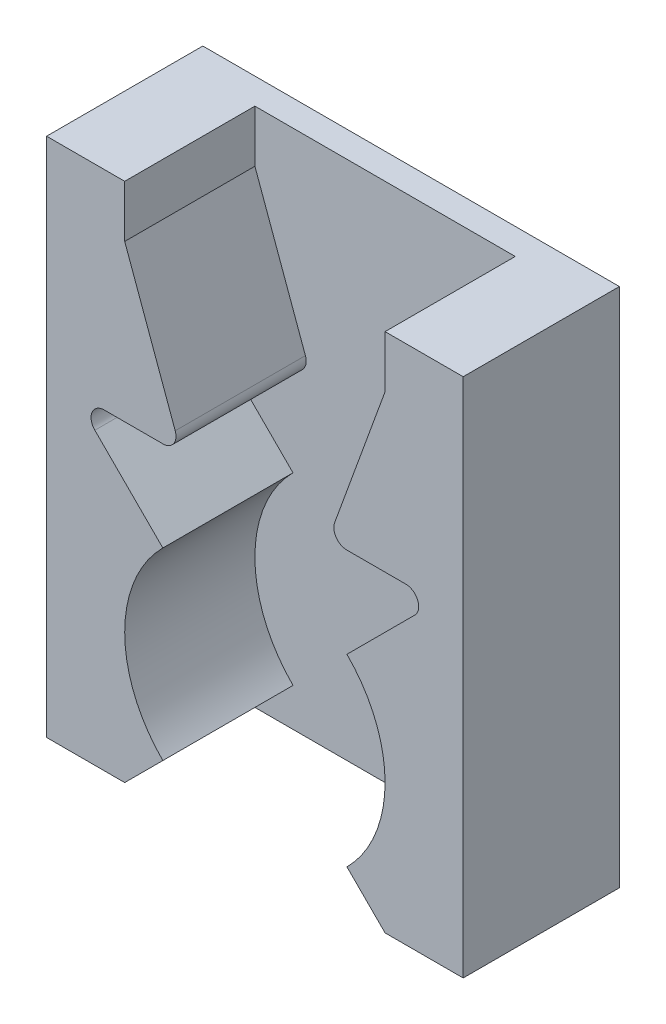
ISO-10303-21;
HEADER;
FILE_DESCRIPTION(('STEP AP214'),'2;1');
FILE_NAME('part.step','',(''),(''),'','','');
FILE_SCHEMA(('AUTOMOTIVE_DESIGN { 1 0 10303 214 1 1 1 1 }'));
ENDSEC;
DATA;
#1=APPLICATION_CONTEXT('core data for automotive mechanical design processes');
#2=APPLICATION_PROTOCOL_DEFINITION('international standard','automotive_design',2000,#1);
#3=PRODUCT_CONTEXT('',#1,'mechanical');
#4=PRODUCT('Part','Part','',(#3));
#5=PRODUCT_RELATED_PRODUCT_CATEGORY('part','',(#4));
#6=PRODUCT_DEFINITION_FORMATION('','',#4);
#7=PRODUCT_DEFINITION_CONTEXT('part definition',#1,'design');
#8=PRODUCT_DEFINITION('design','',#6,#7);
#9=PRODUCT_DEFINITION_SHAPE('','',#8);
#10=(LENGTH_UNIT() NAMED_UNIT(*) SI_UNIT(.MILLI.,.METRE.));
#11=(NAMED_UNIT(*) PLANE_ANGLE_UNIT() SI_UNIT($,.RADIAN.));
#12=(NAMED_UNIT(*) SI_UNIT($,.STERADIAN.) SOLID_ANGLE_UNIT());
#13=UNCERTAINTY_MEASURE_WITH_UNIT(LENGTH_MEASURE(1.E-05),#10,'distance_accuracy_value','');
#14=(GEOMETRIC_REPRESENTATION_CONTEXT(3) GLOBAL_UNCERTAINTY_ASSIGNED_CONTEXT((#13)) GLOBAL_UNIT_ASSIGNED_CONTEXT((#10,
#11,#12)) REPRESENTATION_CONTEXT('',''));
#15=CARTESIAN_POINT('',(0.,0.,0.));
#16=DIRECTION('',(0.,0.,1.));
#17=DIRECTION('',(1.,0.,0.));
#18=AXIS2_PLACEMENT_3D('',#15,#16,#17);
#19=CARTESIAN_POINT('',(-50.,80.,-50.));
#20=DIRECTION('',(1.,0.,0.));
#21=DIRECTION('',(0.,0.,-1.));
#22=AXIS2_PLACEMENT_3D('',#19,#20,#21);
#23=PLANE('',#22);
#24=DIRECTION('',(0.,1.,0.));
#25=VECTOR('',#24,1.);
#26=CARTESIAN_POINT('',(-50.,80.,0.));
#27=LINE('',#26,#25);
#28=CARTESIAN_POINT('',(-50.,80.,0.));
#29=VERTEX_POINT('',#28);
#30=CARTESIAN_POINT('',(-50.,100.,0.));
#31=VERTEX_POINT('',#30);
#32=EDGE_CURVE('E254',#29,#31,#27,.T.);
#33=ORIENTED_EDGE('',*,*,#32,.F.);
#34=DIRECTION('',(0.,0.,1.));
#35=VECTOR('',#34,1.);
#36=CARTESIAN_POINT('',(-50.,80.,-50.));
#37=LINE('',#36,#35);
#38=CARTESIAN_POINT('',(-50.,80.,-50.));
#39=VERTEX_POINT('',#38);
#40=EDGE_CURVE('E297',#39,#29,#37,.T.);
#41=ORIENTED_EDGE('',*,*,#40,.F.);
#42=DIRECTION('',(0.,1.,0.));
#43=VECTOR('',#42,1.);
#44=CARTESIAN_POINT('',(-50.,80.,-50.));
#45=LINE('',#44,#43);
#46=CARTESIAN_POINT('',(-50.,100.,-50.));
#47=VERTEX_POINT('',#46);
#48=EDGE_CURVE('E255',#39,#47,#45,.T.);
#49=ORIENTED_EDGE('',*,*,#48,.T.);
#50=DIRECTION('',(0.,0.,1.));
#51=VECTOR('',#50,1.);
#52=CARTESIAN_POINT('',(-50.,100.,-50.));
#53=LINE('',#52,#51);
#54=EDGE_CURVE('E273',#47,#31,#53,.T.);
#55=ORIENTED_EDGE('',*,*,#54,.T.);
#56=EDGE_LOOP('',(#33,#41,#49,#55));
#57=FACE_BOUND('',#56,.T.);
#58=ADVANCED_FACE('F39',(#57),#23,.T.);
#59=CARTESIAN_POINT('',(-50.,80.,-50.));
#60=DIRECTION('',(0.939692620785909,0.342020143325666,0.));
#61=DIRECTION('',(-0.342020143325666,0.939692620785909,0.));
#62=AXIS2_PLACEMENT_3D('',#59,#60,#61);
#63=PLANE('',#62);
#64=DIRECTION('',(-0.342020143325666,0.939692620785909,0.));
#65=VECTOR('',#64,1.);
#66=CARTESIAN_POINT('',(-50.,80.,0.));
#67=LINE('',#66,#65);
#68=CARTESIAN_POINT('',(-30.6040628738091,26.7101007166284,0.));
#69=VERTEX_POINT('',#68);
#70=EDGE_CURVE('E259',#69,#29,#67,.T.);
#71=ORIENTED_EDGE('',*,*,#70,.F.);
#72=DIRECTION('',(0.,0.,1.));
#73=VECTOR('',#72,1.);
#74=CARTESIAN_POINT('',(-30.604062873809,26.7101007166283,-50.));
#75=LINE('',#74,#73);
#76=CARTESIAN_POINT('',(-30.6040628738091,26.7101007166284,-50.));
#77=VERTEX_POINT('',#76);
#78=EDGE_CURVE('E334',#69,#77,#75,.F.);
#79=ORIENTED_EDGE('',*,*,#78,.T.);
#80=DIRECTION('',(-0.342020143325666,0.939692620785909,0.));
#81=VECTOR('',#80,1.);
#82=CARTESIAN_POINT('',(-50.,80.,-50.));
#83=LINE('',#82,#81);
#84=EDGE_CURVE('E271',#77,#39,#83,.T.);
#85=ORIENTED_EDGE('',*,*,#84,.T.);
#86=ORIENTED_EDGE('',*,*,#40,.T.);
#87=EDGE_LOOP('',(#71,#79,#85,#86));
#88=FACE_BOUND('',#87,.T.);
#89=ADVANCED_FACE('F360',(#88),#63,.T.);
#90=CARTESIAN_POINT('',(-70.0000000000003,20.,-50.));
#91=DIRECTION('',(0.,-1.,0.));
#92=DIRECTION('',(0.,0.,-1.));
#93=AXIS2_PLACEMENT_3D('',#90,#91,#92);
#94=PLANE('',#93);
#95=DIRECTION('',(1.,0.,0.));
#96=VECTOR('',#95,1.);
#97=CARTESIAN_POINT('',(-70.0000000000003,20.,0.));
#98=LINE('',#97,#96);
#99=CARTESIAN_POINT('',(-57.9289321881348,20.,0.));
#100=VERTEX_POINT('',#99);
#101=CARTESIAN_POINT('',(-35.3025259777386,20.,0.));
#102=VERTEX_POINT('',#101);
#103=EDGE_CURVE('E294',#100,#102,#98,.T.);
#104=ORIENTED_EDGE('',*,*,#103,.F.);
#105=DIRECTION('',(0.,0.,1.));
#106=VECTOR('',#105,1.);
#107=CARTESIAN_POINT('',(-57.9289321881348,20.,-50.));
#108=LINE('',#107,#106);
#109=CARTESIAN_POINT('',(-57.9289321881348,20.,-50.));
#110=VERTEX_POINT('',#109);
#111=EDGE_CURVE('E317',#100,#110,#108,.F.);
#112=ORIENTED_EDGE('',*,*,#111,.T.);
#113=DIRECTION('',(1.,0.,0.));
#114=VECTOR('',#113,1.);
#115=CARTESIAN_POINT('',(-70.0000000000003,20.,-50.));
#116=LINE('',#115,#114);
#117=CARTESIAN_POINT('',(-35.3025259777386,20.,-50.));
#118=VERTEX_POINT('',#117);
#119=EDGE_CURVE('E268',#110,#118,#116,.T.);
#120=ORIENTED_EDGE('',*,*,#119,.T.);
#121=DIRECTION('',(0.,0.,1.));
#122=VECTOR('',#121,1.);
#123=CARTESIAN_POINT('',(-35.3025259777386,20.,-50.));
#124=LINE('',#123,#122);
#125=EDGE_CURVE('E314',#118,#102,#124,.T.);
#126=ORIENTED_EDGE('',*,*,#125,.T.);
#127=EDGE_LOOP('',(#104,#112,#120,#126));
#128=FACE_BOUND('',#127,.T.);
#129=ADVANCED_FACE('F367',(#128),#94,.T.);
#130=CARTESIAN_POINT('',(-70.0000000000003,20.,-50.));
#131=DIRECTION('',(0.707106781186546,0.707106781186549,0.));
#132=DIRECTION('',(-0.707106781186549,0.707106781186546,0.));
#133=AXIS2_PLACEMENT_3D('',#130,#131,#132);
#134=PLANE('',#133);
#135=DIRECTION('',(-0.707106781186549,0.707106781186546,0.));
#136=VECTOR('',#135,1.);
#137=CARTESIAN_POINT('',(-70.0000000000003,20.,-50.));
#138=LINE('',#137,#136);
#139=CARTESIAN_POINT('',(-35.3553390593275,-14.6446609406727,-50.));
#140=VERTEX_POINT('',#139);
#141=CARTESIAN_POINT('',(-61.4644660940675,11.4644660940673,-50.));
#142=VERTEX_POINT('',#141);
#143=EDGE_CURVE('E265',#140,#142,#138,.T.);
#144=ORIENTED_EDGE('',*,*,#143,.T.);
#145=DIRECTION('',(0.,0.,1.));
#146=VECTOR('',#145,1.);
#147=CARTESIAN_POINT('',(-61.4644660940675,11.4644660940673,0.));
#148=LINE('',#147,#146);
#149=CARTESIAN_POINT('',(-61.4644660940675,11.4644660940673,0.));
#150=VERTEX_POINT('',#149);
#151=EDGE_CURVE('E300',#142,#150,#148,.T.);
#152=ORIENTED_EDGE('',*,*,#151,.T.);
#153=DIRECTION('',(-0.707106781186549,0.707106781186546,0.));
#154=VECTOR('',#153,1.);
#155=CARTESIAN_POINT('',(-70.0000000000003,20.,0.));
#156=LINE('',#155,#154);
#157=CARTESIAN_POINT('',(-35.3553390593275,-14.6446609406727,0.));
#158=VERTEX_POINT('',#157);
#159=EDGE_CURVE('E291',#158,#150,#156,.T.);
#160=ORIENTED_EDGE('',*,*,#159,.F.);
#161=DIRECTION('',(0.,0.,1.));
#162=VECTOR('',#161,1.);
#163=CARTESIAN_POINT('',(-35.3553390593275,-14.6446609406727,-50.));
#164=LINE('',#163,#162);
#165=EDGE_CURVE('E301',#140,#158,#164,.T.);
#166=ORIENTED_EDGE('',*,*,#165,.F.);
#167=EDGE_LOOP('',(#144,#152,#160,#166));
#168=FACE_BOUND('',#167,.T.);
#169=ADVANCED_FACE('F387',(#168),#134,.T.);
#170=CARTESIAN_POINT('',(0.,-50.,-50.));
#171=DIRECTION('',(0.,0.,1.));
#172=DIRECTION('',(1.,0.,0.));
#173=AXIS2_PLACEMENT_3D('',#170,#171,#172);
#174=CYLINDRICAL_SURFACE('',#173,50.);
#175=CARTESIAN_POINT('',(0.,-50.,0.));
#176=DIRECTION('',(0.,0.,-1.));
#177=DIRECTION('',(1.,0.,0.));
#178=AXIS2_PLACEMENT_3D('',#175,#176,#177);
#179=CIRCLE('',#178,50.);
#180=CARTESIAN_POINT('',(-35.3553390593274,-85.3553390593273,0.));
#181=VERTEX_POINT('',#180);
#182=EDGE_CURVE('E288',#181,#158,#179,.T.);
#183=ORIENTED_EDGE('',*,*,#182,.F.);
#184=DIRECTION('',(0.,0.,1.));
#185=VECTOR('',#184,1.);
#186=CARTESIAN_POINT('',(-35.3553390593274,-85.3553390593273,-50.));
#187=LINE('',#186,#185);
#188=CARTESIAN_POINT('',(-35.3553390593274,-85.3553390593273,-50.));
#189=VERTEX_POINT('',#188);
#190=EDGE_CURVE('E303',#189,#181,#187,.T.);
#191=ORIENTED_EDGE('',*,*,#190,.F.);
#192=CARTESIAN_POINT('',(0.,-50.,-50.));
#193=DIRECTION('',(0.,0.,-1.));
#194=DIRECTION('',(1.,0.,0.));
#195=AXIS2_PLACEMENT_3D('',#192,#193,#194);
#196=CIRCLE('',#195,50.);
#197=EDGE_CURVE('E262',#189,#140,#196,.T.);
#198=ORIENTED_EDGE('',*,*,#197,.T.);
#199=ORIENTED_EDGE('',*,*,#165,.T.);
#200=EDGE_LOOP('',(#183,#191,#198,#199));
#201=FACE_BOUND('',#200,.T.);
#202=ADVANCED_FACE('F392',(#201),#174,.F.);
#203=CARTESIAN_POINT('',(-50.0000000000002,-100.,-50.));
#204=DIRECTION('',(0.707106781186546,-0.707106781186549,0.));
#205=DIRECTION('',(0.707106781186549,0.707106781186546,0.));
#206=AXIS2_PLACEMENT_3D('',#203,#204,#205);
#207=PLANE('',#206);
#208=DIRECTION('',(0.707106781186549,0.707106781186546,0.));
#209=VECTOR('',#208,1.);
#210=CARTESIAN_POINT('',(-50.0000000000002,-100.,0.));
#211=LINE('',#210,#209);
#212=CARTESIAN_POINT('',(-50.0000000000002,-100.,0.));
#213=VERTEX_POINT('',#212);
#214=EDGE_CURVE('E285',#213,#181,#211,.T.);
#215=ORIENTED_EDGE('',*,*,#214,.F.);
#216=DIRECTION('',(0.,0.,1.));
#217=VECTOR('',#216,1.);
#218=CARTESIAN_POINT('',(-50.0000000000002,-100.,-50.));
#219=LINE('',#218,#217);
#220=CARTESIAN_POINT('',(-50.0000000000003,-100.,-50.));
#221=VERTEX_POINT('',#220);
#222=EDGE_CURVE('E305',#221,#213,#219,.T.);
#223=ORIENTED_EDGE('',*,*,#222,.F.);
#224=DIRECTION('',(0.707106781186549,0.707106781186546,0.));
#225=VECTOR('',#224,1.);
#226=CARTESIAN_POINT('',(-50.0000000000002,-100.,-50.));
#227=LINE('',#226,#225);
#228=EDGE_CURVE('E258',#221,#189,#227,.T.);
#229=ORIENTED_EDGE('',*,*,#228,.T.);
#230=ORIENTED_EDGE('',*,*,#190,.T.);
#231=EDGE_LOOP('',(#215,#223,#229,#230));
#232=FACE_BOUND('',#231,.T.);
#233=ADVANCED_FACE('F399',(#232),#207,.T.);
#234=CARTESIAN_POINT('',(-80.,-100.,-50.));
#235=DIRECTION('',(0.,-1.,0.));
#236=DIRECTION('',(0.,0.,-1.));
#237=AXIS2_PLACEMENT_3D('',#234,#235,#236);
#238=PLANE('',#237);
#239=DIRECTION('',(1.,0.,0.));
#240=VECTOR('',#239,1.);
#241=CARTESIAN_POINT('',(-80.,-100.,0.));
#242=LINE('',#241,#240);
#243=CARTESIAN_POINT('',(-80.,-100.,0.));
#244=VERTEX_POINT('',#243);
#245=EDGE_CURVE('E282',#244,#213,#242,.T.);
#246=ORIENTED_EDGE('',*,*,#245,.F.);
#247=DIRECTION('',(0.,0.,1.));
#248=VECTOR('',#247,1.);
#249=CARTESIAN_POINT('',(-80.,-100.,-50.));
#250=LINE('',#249,#248);
#251=CARTESIAN_POINT('',(-80.,-100.,-60.));
#252=VERTEX_POINT('',#251);
#253=EDGE_CURVE('E307',#252,#244,#250,.T.);
#254=ORIENTED_EDGE('',*,*,#253,.F.);
#255=DIRECTION('',(-1.,0.,0.));
#256=VECTOR('',#255,1.);
#257=CARTESIAN_POINT('',(80.,-100.,-60.));
#258=LINE('',#257,#256);
#259=CARTESIAN_POINT('',(80.,-100.,-60.));
#260=VERTEX_POINT('',#259);
#261=EDGE_CURVE('E238',#260,#252,#258,.T.);
#262=ORIENTED_EDGE('',*,*,#261,.F.);
#263=DIRECTION('',(0.,0.,1.));
#264=VECTOR('',#263,1.);
#265=CARTESIAN_POINT('',(80.,-100.,-60.));
#266=LINE('',#265,#264);
#267=CARTESIAN_POINT('',(80.,-100.,0.));
#268=VERTEX_POINT('',#267);
#269=EDGE_CURVE('E248',#260,#268,#266,.T.);
#270=ORIENTED_EDGE('',*,*,#269,.T.);
#271=DIRECTION('',(1.,0.,0.));
#272=VECTOR('',#271,1.);
#273=CARTESIAN_POINT('',(50.0000000000002,-100.,0.));
#274=LINE('',#273,#272);
#275=CARTESIAN_POINT('',(50.0000000000002,-100.,0.));
#276=VERTEX_POINT('',#275);
#277=EDGE_CURVE('E220',#276,#268,#274,.T.);
#278=ORIENTED_EDGE('',*,*,#277,.F.);
#279=DIRECTION('',(0.,0.,1.));
#280=VECTOR('',#279,1.);
#281=CARTESIAN_POINT('',(50.0000000000002,-100.,-50.));
#282=LINE('',#281,#280);
#283=CARTESIAN_POINT('',(50.0000000000002,-100.,-50.));
#284=VERTEX_POINT('',#283);
#285=EDGE_CURVE('E404',#284,#276,#282,.T.);
#286=ORIENTED_EDGE('',*,*,#285,.F.);
#287=DIRECTION('',(-1.,0.,0.));
#288=VECTOR('',#287,1.);
#289=CARTESIAN_POINT('',(80.,-100.,-50.));
#290=LINE('',#289,#288);
#291=EDGE_CURVE('E215',#284,#221,#290,.T.);
#292=ORIENTED_EDGE('',*,*,#291,.T.);
#293=ORIENTED_EDGE('',*,*,#222,.T.);
#294=EDGE_LOOP('',(#246,#254,#262,#270,#278,#286,#292,#293));
#295=FACE_BOUND('',#294,.T.);
#296=ADVANCED_FACE('F402',(#295),#238,.T.);
#297=CARTESIAN_POINT('',(-80.,100.,-50.));
#298=DIRECTION('',(-1.,0.,0.));
#299=DIRECTION('',(0.,0.,1.));
#300=AXIS2_PLACEMENT_3D('',#297,#298,#299);
#301=PLANE('',#300);
#302=DIRECTION('',(0.,-1.,0.));
#303=VECTOR('',#302,1.);
#304=CARTESIAN_POINT('',(-80.,100.,0.));
#305=LINE('',#304,#303);
#306=CARTESIAN_POINT('',(-80.,100.,0.));
#307=VERTEX_POINT('',#306);
#308=EDGE_CURVE('E279',#307,#244,#305,.T.);
#309=ORIENTED_EDGE('',*,*,#308,.F.);
#310=DIRECTION('',(0.,0.,1.));
#311=VECTOR('',#310,1.);
#312=CARTESIAN_POINT('',(-80.,100.,-50.));
#313=LINE('',#312,#311);
#314=CARTESIAN_POINT('',(-80.,100.,-60.));
#315=VERTEX_POINT('',#314);
#316=EDGE_CURVE('E309',#315,#307,#313,.T.);
#317=ORIENTED_EDGE('',*,*,#316,.F.);
#318=DIRECTION('',(0.,-1.,0.));
#319=VECTOR('',#318,1.);
#320=CARTESIAN_POINT('',(-80.,100.,-60.));
#321=LINE('',#320,#319);
#322=EDGE_CURVE('E241',#315,#252,#321,.T.);
#323=ORIENTED_EDGE('',*,*,#322,.T.);
#324=ORIENTED_EDGE('',*,*,#253,.T.);
#325=EDGE_LOOP('',(#309,#317,#323,#324));
#326=FACE_BOUND('',#325,.T.);
#327=ADVANCED_FACE('F455',(#326),#301,.T.);
#328=CARTESIAN_POINT('',(-80.,100.,-50.));
#329=DIRECTION('',(0.,1.,0.));
#330=DIRECTION('',(0.,0.,1.));
#331=AXIS2_PLACEMENT_3D('',#328,#329,#330);
#332=PLANE('',#331);
#333=DIRECTION('',(-1.,0.,0.));
#334=VECTOR('',#333,1.);
#335=CARTESIAN_POINT('',(-80.,100.,0.));
#336=LINE('',#335,#334);
#337=EDGE_CURVE('E276',#31,#307,#336,.T.);
#338=ORIENTED_EDGE('',*,*,#337,.F.);
#339=ORIENTED_EDGE('',*,*,#54,.F.);
#340=DIRECTION('',(-1.,0.,0.));
#341=VECTOR('',#340,1.);
#342=CARTESIAN_POINT('',(80.,100.,-50.));
#343=LINE('',#342,#341);
#344=CARTESIAN_POINT('',(50.,100.,-50.));
#345=VERTEX_POINT('',#344);
#346=EDGE_CURVE('E218',#345,#47,#343,.T.);
#347=ORIENTED_EDGE('',*,*,#346,.F.);
#348=DIRECTION('',(0.,0.,1.));
#349=VECTOR('',#348,1.);
#350=CARTESIAN_POINT('',(50.,100.,-50.));
#351=LINE('',#350,#349);
#352=CARTESIAN_POINT('',(50.,100.,0.));
#353=VERTEX_POINT('',#352);
#354=EDGE_CURVE('E407',#345,#353,#351,.T.);
#355=ORIENTED_EDGE('',*,*,#354,.T.);
#356=DIRECTION('',(-1.,0.,0.));
#357=VECTOR('',#356,1.);
#358=CARTESIAN_POINT('',(50.,100.,0.));
#359=LINE('',#358,#357);
#360=CARTESIAN_POINT('',(80.,100.,0.));
#361=VERTEX_POINT('',#360);
#362=EDGE_CURVE('E421',#361,#353,#359,.T.);
#363=ORIENTED_EDGE('',*,*,#362,.F.);
#364=DIRECTION('',(0.,0.,1.));
#365=VECTOR('',#364,1.);
#366=CARTESIAN_POINT('',(80.,100.,-60.));
#367=LINE('',#366,#365);
#368=CARTESIAN_POINT('',(80.,100.,-60.));
#369=VERTEX_POINT('',#368);
#370=EDGE_CURVE('E252',#369,#361,#367,.T.);
#371=ORIENTED_EDGE('',*,*,#370,.F.);
#372=DIRECTION('',(-1.,0.,0.));
#373=VECTOR('',#372,1.);
#374=CARTESIAN_POINT('',(80.,100.,-60.));
#375=LINE('',#374,#373);
#376=EDGE_CURVE('E244',#369,#315,#375,.T.);
#377=ORIENTED_EDGE('',*,*,#376,.T.);
#378=ORIENTED_EDGE('',*,*,#316,.T.);
#379=EDGE_LOOP('',(#338,#339,#347,#355,#363,#371,#377,#378));
#380=FACE_BOUND('',#379,.T.);
#381=ADVANCED_FACE('F373',(#380),#332,.T.);
#382=CARTESIAN_POINT('',(0.,-50.,0.));
#383=DIRECTION('',(0.,0.,1.));
#384=DIRECTION('',(1.,0.,0.));
#385=AXIS2_PLACEMENT_3D('',#382,#383,#384);
#386=PLANE('',#385);
#387=ORIENTED_EDGE('',*,*,#103,.T.);
#388=CARTESIAN_POINT('',(-35.3025259777386,25.,0.));
#389=DIRECTION('',(0.,0.,1.));
#390=DIRECTION('',(1.,0.,0.));
#391=AXIS2_PLACEMENT_3D('',#388,#389,#390);
#392=CIRCLE('',#391,5.);
#393=EDGE_CURVE('E54',#102,#69,#392,.T.);
#394=ORIENTED_EDGE('',*,*,#393,.T.);
#395=ORIENTED_EDGE('',*,*,#70,.T.);
#396=ORIENTED_EDGE('',*,*,#32,.T.);
#397=ORIENTED_EDGE('',*,*,#337,.T.);
#398=ORIENTED_EDGE('',*,*,#308,.T.);
#399=ORIENTED_EDGE('',*,*,#245,.T.);
#400=ORIENTED_EDGE('',*,*,#214,.T.);
#401=ORIENTED_EDGE('',*,*,#182,.T.);
#402=ORIENTED_EDGE('',*,*,#159,.T.);
#403=CARTESIAN_POINT('',(-57.9289321881348,15.,0.));
#404=DIRECTION('',(0.,0.,1.));
#405=DIRECTION('',(1.,0.,0.));
#406=AXIS2_PLACEMENT_3D('',#403,#404,#405);
#407=CIRCLE('',#406,5.);
#408=EDGE_CURVE('E336',#150,#100,#407,.F.);
#409=ORIENTED_EDGE('',*,*,#408,.T.);
#410=EDGE_LOOP('',(#387,#394,#395,#396,#397,#398,#399,#400,#401,#402,#409));
#411=FACE_BOUND('',#410,.T.);
#412=ADVANCED_FACE('F452',(#411),#386,.T.);
#413=CARTESIAN_POINT('',(0.,0.,-50.));
#414=DIRECTION('',(0.,0.,1.));
#415=DIRECTION('',(1.,0.,0.));
#416=AXIS2_PLACEMENT_3D('',#413,#414,#415);
#417=PLANE('',#416);
#418=ORIENTED_EDGE('',*,*,#119,.F.);
#419=CARTESIAN_POINT('',(-57.9289321881348,15.,-50.));
#420=DIRECTION('',(0.,0.,1.));
#421=DIRECTION('',(1.,0.,0.));
#422=AXIS2_PLACEMENT_3D('',#419,#420,#421);
#423=CIRCLE('',#422,5.);
#424=EDGE_CURVE('E321',#110,#142,#423,.T.);
#425=ORIENTED_EDGE('',*,*,#424,.T.);
#426=ORIENTED_EDGE('',*,*,#143,.F.);
#427=ORIENTED_EDGE('',*,*,#197,.F.);
#428=ORIENTED_EDGE('',*,*,#228,.F.);
#429=ORIENTED_EDGE('',*,*,#291,.F.);
#430=DIRECTION('',(0.707106781186549,-0.707106781186546,0.));
#431=VECTOR('',#430,1.);
#432=CARTESIAN_POINT('',(35.3553390593274,-85.3553390593273,-50.));
#433=LINE('',#432,#431);
#434=CARTESIAN_POINT('',(35.3553390593274,-85.3553390593273,-50.));
#435=VERTEX_POINT('',#434);
#436=EDGE_CURVE('E234',#435,#284,#433,.T.);
#437=ORIENTED_EDGE('',*,*,#436,.F.);
#438=CARTESIAN_POINT('',(0.,-50.,-50.));
#439=DIRECTION('',(0.,0.,-1.));
#440=DIRECTION('',(1.,0.,0.));
#441=AXIS2_PLACEMENT_3D('',#438,#439,#440);
#442=CIRCLE('',#441,50.);
#443=CARTESIAN_POINT('',(35.3553390593275,-14.6446609406727,-50.));
#444=VERTEX_POINT('',#443);
#445=EDGE_CURVE('E200',#444,#435,#442,.T.);
#446=ORIENTED_EDGE('',*,*,#445,.F.);
#447=DIRECTION('',(-0.707106781186549,-0.707106781186546,0.));
#448=VECTOR('',#447,1.);
#449=CARTESIAN_POINT('',(70.0000000000003,20.,-50.));
#450=LINE('',#449,#448);
#451=CARTESIAN_POINT('',(61.4644660940675,11.4644660940673,-50.));
#452=VERTEX_POINT('',#451);
#453=EDGE_CURVE('E206',#452,#444,#450,.T.);
#454=ORIENTED_EDGE('',*,*,#453,.F.);
#455=CARTESIAN_POINT('',(57.9289321881348,15.,-50.));
#456=DIRECTION('',(0.,0.,1.));
#457=DIRECTION('',(1.,0.,0.));
#458=AXIS2_PLACEMENT_3D('',#455,#456,#457);
#459=CIRCLE('',#458,5.);
#460=CARTESIAN_POINT('',(57.9289321881348,20.,-50.));
#461=VERTEX_POINT('',#460);
#462=EDGE_CURVE('E319',#452,#461,#459,.T.);
#463=ORIENTED_EDGE('',*,*,#462,.T.);
#464=DIRECTION('',(1.,0.,0.));
#465=VECTOR('',#464,1.);
#466=CARTESIAN_POINT('',(28.1617859440276,20.,-50.));
#467=LINE('',#466,#465);
#468=CARTESIAN_POINT('',(35.3025259777382,20.,-50.));
#469=VERTEX_POINT('',#468);
#470=EDGE_CURVE('E225',#469,#461,#467,.T.);
#471=ORIENTED_EDGE('',*,*,#470,.F.);
#472=CARTESIAN_POINT('',(35.3025259777382,25.,-50.));
#473=DIRECTION('',(0.,0.,1.));
#474=DIRECTION('',(1.,0.,0.));
#475=AXIS2_PLACEMENT_3D('',#472,#473,#474);
#476=CIRCLE('',#475,5.);
#477=CARTESIAN_POINT('',(30.6040628738087,26.7101007166284,-50.));
#478=VERTEX_POINT('',#477);
#479=EDGE_CURVE('E47',#469,#478,#476,.F.);
#480=ORIENTED_EDGE('',*,*,#479,.T.);
#481=DIRECTION('',(-0.342020143325673,-0.939692620785907,0.));
#482=VECTOR('',#481,1.);
#483=CARTESIAN_POINT('',(50.,80.,-50.));
#484=LINE('',#483,#482);
#485=CARTESIAN_POINT('',(50.,80.,-50.));
#486=VERTEX_POINT('',#485);
#487=EDGE_CURVE('E228',#486,#478,#484,.T.);
#488=ORIENTED_EDGE('',*,*,#487,.F.);
#489=DIRECTION('',(0.,-1.,0.));
#490=VECTOR('',#489,1.);
#491=CARTESIAN_POINT('',(50.,80.,-50.));
#492=LINE('',#491,#490);
#493=EDGE_CURVE('E231',#345,#486,#492,.T.);
#494=ORIENTED_EDGE('',*,*,#493,.F.);
#495=ORIENTED_EDGE('',*,*,#346,.T.);
#496=ORIENTED_EDGE('',*,*,#48,.F.);
#497=ORIENTED_EDGE('',*,*,#84,.F.);
#498=CARTESIAN_POINT('',(-35.3025259777386,25.,-50.));
#499=DIRECTION('',(0.,0.,1.));
#500=DIRECTION('',(1.,0.,0.));
#501=AXIS2_PLACEMENT_3D('',#498,#499,#500);
#502=CIRCLE('',#501,5.);
#503=EDGE_CURVE('E11',#77,#118,#502,.F.);
#504=ORIENTED_EDGE('',*,*,#503,.T.);
#505=EDGE_LOOP('',(#418,#425,#426,#427,#428,#429,#437,#446,#454,#463,#471,#480,#488,#494,#495,
#496,#497,#504));
#506=FACE_BOUND('',#505,.T.);
#507=ADVANCED_FACE('F343',(#506),#417,.T.);
#508=CARTESIAN_POINT('',(80.,100.,-60.));
#509=DIRECTION('',(-1.,0.,0.));
#510=DIRECTION('',(0.,0.,1.));
#511=AXIS2_PLACEMENT_3D('',#508,#509,#510);
#512=PLANE('',#511);
#513=ORIENTED_EDGE('',*,*,#370,.T.);
#514=DIRECTION('',(0.,1.,0.));
#515=VECTOR('',#514,1.);
#516=CARTESIAN_POINT('',(80.,100.,0.));
#517=LINE('',#516,#515);
#518=EDGE_CURVE('E424',#268,#361,#517,.T.);
#519=ORIENTED_EDGE('',*,*,#518,.F.);
#520=ORIENTED_EDGE('',*,*,#269,.F.);
#521=DIRECTION('',(0.,-1.,0.));
#522=VECTOR('',#521,1.);
#523=CARTESIAN_POINT('',(80.,100.,-60.));
#524=LINE('',#523,#522);
#525=EDGE_CURVE('E247',#369,#260,#524,.T.);
#526=ORIENTED_EDGE('',*,*,#525,.F.);
#527=EDGE_LOOP('',(#513,#519,#520,#526));
#528=FACE_BOUND('',#527,.T.);
#529=ADVANCED_FACE('F430',(#528),#512,.F.);
#530=CARTESIAN_POINT('',(0.,0.,-60.));
#531=DIRECTION('',(0.,0.,1.));
#532=DIRECTION('',(1.,0.,0.));
#533=AXIS2_PLACEMENT_3D('',#530,#531,#532);
#534=PLANE('',#533);
#535=ORIENTED_EDGE('',*,*,#261,.T.);
#536=ORIENTED_EDGE('',*,*,#322,.F.);
#537=ORIENTED_EDGE('',*,*,#376,.F.);
#538=ORIENTED_EDGE('',*,*,#525,.T.);
#539=EDGE_LOOP('',(#535,#536,#537,#538));
#540=FACE_BOUND('',#539,.T.);
#541=ADVANCED_FACE('F458',(#540),#534,.F.);
#542=CARTESIAN_POINT('',(0.,-50.,-50.));
#543=DIRECTION('',(0.,0.,1.));
#544=DIRECTION('',(1.,0.,0.));
#545=AXIS2_PLACEMENT_3D('',#542,#543,#544);
#546=CYLINDRICAL_SURFACE('',#545,50.);
#547=CARTESIAN_POINT('',(0.,-50.,0.));
#548=DIRECTION('',(0.,0.,-1.));
#549=DIRECTION('',(1.,0.,0.));
#550=AXIS2_PLACEMENT_3D('',#547,#548,#549);
#551=CIRCLE('',#550,50.);
#552=CARTESIAN_POINT('',(35.3553390593275,-14.6446609406727,0.));
#553=VERTEX_POINT('',#552);
#554=CARTESIAN_POINT('',(35.3553390593274,-85.3553390593273,0.));
#555=VERTEX_POINT('',#554);
#556=EDGE_CURVE('E194',#553,#555,#551,.T.);
#557=ORIENTED_EDGE('',*,*,#556,.F.);
#558=DIRECTION('',(0.,0.,1.));
#559=VECTOR('',#558,1.);
#560=CARTESIAN_POINT('',(35.3553390593275,-14.6446609406727,-50.));
#561=LINE('',#560,#559);
#562=EDGE_CURVE('E203',#444,#553,#561,.T.);
#563=ORIENTED_EDGE('',*,*,#562,.F.);
#564=ORIENTED_EDGE('',*,*,#445,.T.);
#565=DIRECTION('',(0.,0.,1.));
#566=VECTOR('',#565,1.);
#567=CARTESIAN_POINT('',(35.3553390593274,-85.3553390593273,-50.));
#568=LINE('',#567,#566);
#569=EDGE_CURVE('E213',#435,#555,#568,.T.);
#570=ORIENTED_EDGE('',*,*,#569,.T.);
#571=EDGE_LOOP('',(#557,#563,#564,#570));
#572=FACE_BOUND('',#571,.T.);
#573=ADVANCED_FACE('F212',(#572),#546,.F.);
#574=CARTESIAN_POINT('',(70.0000000000003,20.,-50.));
#575=DIRECTION('',(-0.707106781186546,0.707106781186549,0.));
#576=DIRECTION('',(-0.707106781186549,-0.707106781186546,0.));
#577=AXIS2_PLACEMENT_3D('',#574,#575,#576);
#578=PLANE('',#577);
#579=DIRECTION('',(-0.707106781186549,-0.707106781186546,0.));
#580=VECTOR('',#579,1.);
#581=CARTESIAN_POINT('',(70.0000000000003,20.,0.));
#582=LINE('',#581,#580);
#583=CARTESIAN_POINT('',(61.4644660940675,11.4644660940673,0.));
#584=VERTEX_POINT('',#583);
#585=EDGE_CURVE('E188',#584,#553,#582,.T.);
#586=ORIENTED_EDGE('',*,*,#585,.F.);
#587=DIRECTION('',(0.,0.,1.));
#588=VECTOR('',#587,1.);
#589=CARTESIAN_POINT('',(61.4644660940675,11.4644660940673,-50.));
#590=LINE('',#589,#588);
#591=EDGE_CURVE('E328',#584,#452,#590,.F.);
#592=ORIENTED_EDGE('',*,*,#591,.T.);
#593=ORIENTED_EDGE('',*,*,#453,.T.);
#594=ORIENTED_EDGE('',*,*,#562,.T.);
#595=EDGE_LOOP('',(#586,#592,#593,#594));
#596=FACE_BOUND('',#595,.T.);
#597=ADVANCED_FACE('F204',(#596),#578,.T.);
#598=CARTESIAN_POINT('',(28.1617859440276,20.,-50.));
#599=DIRECTION('',(0.,-1.,0.));
#600=DIRECTION('',(0.,0.,-1.));
#601=AXIS2_PLACEMENT_3D('',#598,#599,#600);
#602=PLANE('',#601);
#603=ORIENTED_EDGE('',*,*,#470,.T.);
#604=DIRECTION('',(0.,0.,1.));
#605=VECTOR('',#604,1.);
#606=CARTESIAN_POINT('',(57.9289321881348,20.,0.));
#607=LINE('',#606,#605);
#608=CARTESIAN_POINT('',(57.9289321881348,20.,0.));
#609=VERTEX_POINT('',#608);
#610=EDGE_CURVE('E325',#461,#609,#607,.T.);
#611=ORIENTED_EDGE('',*,*,#610,.T.);
#612=DIRECTION('',(1.,0.,0.));
#613=VECTOR('',#612,1.);
#614=CARTESIAN_POINT('',(28.1617859440276,20.,0.));
#615=LINE('',#614,#613);
#616=CARTESIAN_POINT('',(35.3025259777382,20.,0.));
#617=VERTEX_POINT('',#616);
#618=EDGE_CURVE('E199',#617,#609,#615,.T.);
#619=ORIENTED_EDGE('',*,*,#618,.F.);
#620=DIRECTION('',(0.,0.,1.));
#621=VECTOR('',#620,1.);
#622=CARTESIAN_POINT('',(35.3025259777382,20.,-50.));
#623=LINE('',#622,#621);
#624=EDGE_CURVE('E323',#617,#469,#623,.F.);
#625=ORIENTED_EDGE('',*,*,#624,.T.);
#626=EDGE_LOOP('',(#603,#611,#619,#625));
#627=FACE_BOUND('',#626,.T.);
#628=ADVANCED_FACE('F413',(#627),#602,.T.);
#629=CARTESIAN_POINT('',(50.,80.,-50.));
#630=DIRECTION('',(-0.939692620785907,0.342020143325673,0.));
#631=DIRECTION('',(-0.342020143325673,-0.939692620785907,0.));
#632=AXIS2_PLACEMENT_3D('',#629,#630,#631);
#633=PLANE('',#632);
#634=ORIENTED_EDGE('',*,*,#487,.T.);
#635=DIRECTION('',(0.,0.,1.));
#636=VECTOR('',#635,1.);
#637=CARTESIAN_POINT('',(30.6040628738087,26.7101007166284,-50.));
#638=LINE('',#637,#636);
#639=CARTESIAN_POINT('',(30.6040628738087,26.7101007166284,0.));
#640=VERTEX_POINT('',#639);
#641=EDGE_CURVE('E330',#478,#640,#638,.T.);
#642=ORIENTED_EDGE('',*,*,#641,.T.);
#643=DIRECTION('',(-0.342020143325673,-0.939692620785907,0.));
#644=VECTOR('',#643,1.);
#645=CARTESIAN_POINT('',(50.,80.,0.));
#646=LINE('',#645,#644);
#647=CARTESIAN_POINT('',(50.,80.,0.));
#648=VERTEX_POINT('',#647);
#649=EDGE_CURVE('E414',#648,#640,#646,.T.);
#650=ORIENTED_EDGE('',*,*,#649,.F.);
#651=DIRECTION('',(0.,0.,1.));
#652=VECTOR('',#651,1.);
#653=CARTESIAN_POINT('',(50.,80.,-50.));
#654=LINE('',#653,#652);
#655=EDGE_CURVE('E210',#486,#648,#654,.T.);
#656=ORIENTED_EDGE('',*,*,#655,.F.);
#657=EDGE_LOOP('',(#634,#642,#650,#656));
#658=FACE_BOUND('',#657,.T.);
#659=ADVANCED_FACE('F346',(#658),#633,.T.);
#660=CARTESIAN_POINT('',(50.,80.,-50.));
#661=DIRECTION('',(-1.,0.,0.));
#662=DIRECTION('',(0.,0.,1.));
#663=AXIS2_PLACEMENT_3D('',#660,#661,#662);
#664=PLANE('',#663);
#665=DIRECTION('',(0.,-1.,0.));
#666=VECTOR('',#665,1.);
#667=CARTESIAN_POINT('',(50.,80.,0.));
#668=LINE('',#667,#666);
#669=EDGE_CURVE('E416',#353,#648,#668,.T.);
#670=ORIENTED_EDGE('',*,*,#669,.F.);
#671=ORIENTED_EDGE('',*,*,#354,.F.);
#672=ORIENTED_EDGE('',*,*,#493,.T.);
#673=ORIENTED_EDGE('',*,*,#655,.T.);
#674=EDGE_LOOP('',(#670,#671,#672,#673));
#675=FACE_BOUND('',#674,.T.);
#676=ADVANCED_FACE('F441',(#675),#664,.T.);
#677=CARTESIAN_POINT('',(35.3553390593274,-85.3553390593273,-50.));
#678=DIRECTION('',(-0.707106781186546,-0.707106781186549,0.));
#679=DIRECTION('',(0.707106781186549,-0.707106781186546,0.));
#680=AXIS2_PLACEMENT_3D('',#677,#678,#679);
#681=PLANE('',#680);
#682=DIRECTION('',(0.707106781186549,-0.707106781186546,0.));
#683=VECTOR('',#682,1.);
#684=CARTESIAN_POINT('',(35.3553390593274,-85.3553390593273,0.));
#685=LINE('',#684,#683);
#686=EDGE_CURVE('E216',#555,#276,#685,.T.);
#687=ORIENTED_EDGE('',*,*,#686,.F.);
#688=ORIENTED_EDGE('',*,*,#569,.F.);
#689=ORIENTED_EDGE('',*,*,#436,.T.);
#690=ORIENTED_EDGE('',*,*,#285,.T.);
#691=EDGE_LOOP('',(#687,#688,#689,#690));
#692=FACE_BOUND('',#691,.T.);
#693=ADVANCED_FACE('F380',(#692),#681,.T.);
#694=CARTESIAN_POINT('',(0.,-50.,0.));
#695=DIRECTION('',(0.,0.,1.));
#696=DIRECTION('',(1.,0.,0.));
#697=AXIS2_PLACEMENT_3D('',#694,#695,#696);
#698=PLANE('',#697);
#699=ORIENTED_EDGE('',*,*,#649,.T.);
#700=CARTESIAN_POINT('',(35.3025259777382,25.,0.));
#701=DIRECTION('',(0.,0.,1.));
#702=DIRECTION('',(1.,0.,0.));
#703=AXIS2_PLACEMENT_3D('',#700,#701,#702);
#704=CIRCLE('',#703,5.);
#705=EDGE_CURVE('E62',#640,#617,#704,.T.);
#706=ORIENTED_EDGE('',*,*,#705,.T.);
#707=ORIENTED_EDGE('',*,*,#618,.T.);
#708=CARTESIAN_POINT('',(57.9289321881348,15.,0.));
#709=DIRECTION('',(0.,0.,1.));
#710=DIRECTION('',(1.,0.,0.));
#711=AXIS2_PLACEMENT_3D('',#708,#709,#710);
#712=CIRCLE('',#711,5.);
#713=EDGE_CURVE('E196',#609,#584,#712,.F.);
#714=ORIENTED_EDGE('',*,*,#713,.T.);
#715=ORIENTED_EDGE('',*,*,#585,.T.);
#716=ORIENTED_EDGE('',*,*,#556,.T.);
#717=ORIENTED_EDGE('',*,*,#686,.T.);
#718=ORIENTED_EDGE('',*,*,#277,.T.);
#719=ORIENTED_EDGE('',*,*,#518,.T.);
#720=ORIENTED_EDGE('',*,*,#362,.T.);
#721=ORIENTED_EDGE('',*,*,#669,.T.);
#722=EDGE_LOOP('',(#699,#706,#707,#714,#715,#716,#717,#718,#719,#720,#721));
#723=FACE_BOUND('',#722,.T.);
#724=ADVANCED_FACE('F191',(#723),#698,.T.);
#725=CARTESIAN_POINT('',(-57.9289321881348,15.,-50.));
#726=DIRECTION('',(0.,0.,-1.));
#727=DIRECTION('',(-1.,0.,0.));
#728=AXIS2_PLACEMENT_3D('',#725,#726,#727);
#729=CYLINDRICAL_SURFACE('',#728,5.);
#730=ORIENTED_EDGE('',*,*,#424,.F.);
#731=ORIENTED_EDGE('',*,*,#111,.F.);
#732=ORIENTED_EDGE('',*,*,#408,.F.);
#733=ORIENTED_EDGE('',*,*,#151,.F.);
#734=EDGE_LOOP('',(#730,#731,#732,#733));
#735=FACE_BOUND('',#734,.T.);
#736=ADVANCED_FACE('F356',(#735),#729,.F.);
#737=CARTESIAN_POINT('',(57.9289321881348,15.,-50.));
#738=DIRECTION('',(0.,0.,-1.));
#739=DIRECTION('',(-1.,0.,0.));
#740=AXIS2_PLACEMENT_3D('',#737,#738,#739);
#741=CYLINDRICAL_SURFACE('',#740,5.);
#742=ORIENTED_EDGE('',*,*,#462,.F.);
#743=ORIENTED_EDGE('',*,*,#591,.F.);
#744=ORIENTED_EDGE('',*,*,#713,.F.);
#745=ORIENTED_EDGE('',*,*,#610,.F.);
#746=EDGE_LOOP('',(#742,#743,#744,#745));
#747=FACE_BOUND('',#746,.T.);
#748=ADVANCED_FACE('F350',(#747),#741,.F.);
#749=CARTESIAN_POINT('',(35.3025259777382,25.,-50.));
#750=DIRECTION('',(0.,0.,1.));
#751=DIRECTION('',(1.,0.,0.));
#752=AXIS2_PLACEMENT_3D('',#749,#750,#751);
#753=CYLINDRICAL_SURFACE('',#752,5.);
#754=ORIENTED_EDGE('',*,*,#479,.F.);
#755=ORIENTED_EDGE('',*,*,#624,.F.);
#756=ORIENTED_EDGE('',*,*,#705,.F.);
#757=ORIENTED_EDGE('',*,*,#641,.F.);
#758=EDGE_LOOP('',(#754,#755,#756,#757));
#759=FACE_BOUND('',#758,.T.);
#760=ADVANCED_FACE('F348',(#759),#753,.T.);
#761=CARTESIAN_POINT('',(-35.3025259777386,25.,-50.));
#762=DIRECTION('',(0.,0.,1.));
#763=DIRECTION('',(1.,0.,0.));
#764=AXIS2_PLACEMENT_3D('',#761,#762,#763);
#765=CYLINDRICAL_SURFACE('',#764,5.);
#766=ORIENTED_EDGE('',*,*,#503,.F.);
#767=ORIENTED_EDGE('',*,*,#78,.F.);
#768=ORIENTED_EDGE('',*,*,#393,.F.);
#769=ORIENTED_EDGE('',*,*,#125,.F.);
#770=EDGE_LOOP('',(#766,#767,#768,#769));
#771=FACE_BOUND('',#770,.T.);
#772=ADVANCED_FACE('F41',(#771),#765,.T.);
#773=CLOSED_SHELL('',(#58,#89,#129,#169,#202,#233,#296,#327,#381,#412,#507,#529,#541,#573,#597,
#628,#659,#676,#693,#724,#736,#748,#760,#772));
#774=MANIFOLD_SOLID_BREP('B2',#773);
#775=ADVANCED_BREP_SHAPE_REPRESENTATION('',(#18,#774),#14);
#776=SHAPE_DEFINITION_REPRESENTATION(#9,#775);
ENDSEC;
END-ISO-10303-21;
